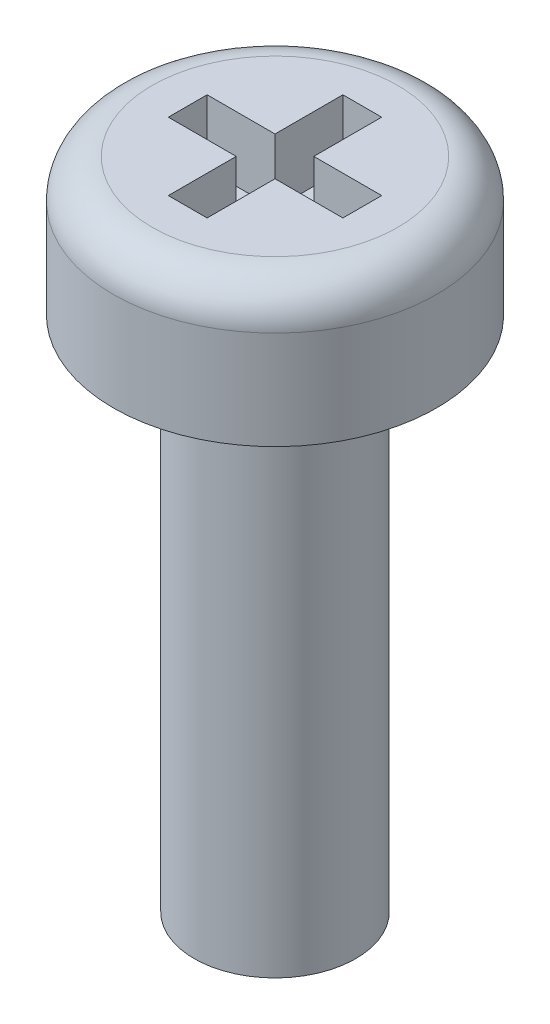
ISO-10303-21;
HEADER;
FILE_DESCRIPTION(('STEP AP214'),'2;1');
FILE_NAME('part.step','',(''),(''),'','','');
FILE_SCHEMA(('AUTOMOTIVE_DESIGN { 1 0 10303 214 1 1 1 1 }'));
ENDSEC;
DATA;
#1=APPLICATION_CONTEXT('core data for automotive mechanical design processes');
#2=APPLICATION_PROTOCOL_DEFINITION('international standard','automotive_design',2000,#1);
#3=PRODUCT_CONTEXT('',#1,'mechanical');
#4=PRODUCT('Part','Part','',(#3));
#5=PRODUCT_RELATED_PRODUCT_CATEGORY('part','',(#4));
#6=PRODUCT_DEFINITION_FORMATION('','',#4);
#7=PRODUCT_DEFINITION_CONTEXT('part definition',#1,'design');
#8=PRODUCT_DEFINITION('design','',#6,#7);
#9=PRODUCT_DEFINITION_SHAPE('','',#8);
#10=(LENGTH_UNIT() NAMED_UNIT(*) SI_UNIT(.MILLI.,.METRE.));
#11=(NAMED_UNIT(*) PLANE_ANGLE_UNIT() SI_UNIT($,.RADIAN.));
#12=(NAMED_UNIT(*) SI_UNIT($,.STERADIAN.) SOLID_ANGLE_UNIT());
#13=UNCERTAINTY_MEASURE_WITH_UNIT(LENGTH_MEASURE(1.E-05),#10,'distance_accuracy_value','');
#14=(GEOMETRIC_REPRESENTATION_CONTEXT(3) GLOBAL_UNCERTAINTY_ASSIGNED_CONTEXT((#13)) GLOBAL_UNIT_ASSIGNED_CONTEXT((#10,
#11,#12)) REPRESENTATION_CONTEXT('',''));
#15=CARTESIAN_POINT('',(0.,0.,0.));
#16=DIRECTION('',(0.,0.,1.));
#17=DIRECTION('',(1.,0.,0.));
#18=AXIS2_PLACEMENT_3D('',#15,#16,#17);
#19=CARTESIAN_POINT('',(1.25,0.,0.));
#20=DIRECTION('',(0.,-1.,0.));
#21=DIRECTION('',(0.,0.,-1.));
#22=AXIS2_PLACEMENT_3D('',#19,#20,#21);
#23=PLANE('',#22);
#24=CARTESIAN_POINT('',(0.,0.,0.));
#25=DIRECTION('',(0.,-1.,0.));
#26=DIRECTION('',(0.,0.,-1.));
#27=AXIS2_PLACEMENT_3D('',#24,#25,#26);
#28=CIRCLE('',#27,1.25);
#29=CARTESIAN_POINT('',(0.,0.,-1.25));
#30=VERTEX_POINT('',#29);
#31=EDGE_CURVE('E189',#30,#30,#28,.T.);
#32=ORIENTED_EDGE('',*,*,#31,.T.);
#33=EDGE_LOOP('',(#32));
#34=FACE_BOUND('',#33,.T.);
#35=ADVANCED_FACE('F33',(#34),#23,.T.);
#36=CARTESIAN_POINT('',(0.,10.12,0.));
#37=DIRECTION('',(0.,1.,0.));
#38=DIRECTION('',(0.,0.,1.));
#39=AXIS2_PLACEMENT_3D('',#36,#37,#38);
#40=PLANE('',#39);
#41=CARTESIAN_POINT('',(0.,10.12,0.));
#42=DIRECTION('',(0.,1.,0.));
#43=DIRECTION('',(0.,0.,1.));
#44=AXIS2_PLACEMENT_3D('',#41,#42,#43);
#45=CIRCLE('',#44,1.9);
#46=CARTESIAN_POINT('',(0.,10.12,1.9));
#47=VERTEX_POINT('',#46);
#48=EDGE_CURVE('E11',#47,#47,#45,.T.);
#49=ORIENTED_EDGE('',*,*,#48,.T.);
#50=EDGE_LOOP('',(#49));
#51=FACE_BOUND('',#50,.T.);
#52=DIRECTION('',(0.,0.,1.));
#53=VECTOR('',#52,1.);
#54=CARTESIAN_POINT('',(-1.35,10.12,0.3));
#55=LINE('',#54,#53);
#56=CARTESIAN_POINT('',(-1.35,10.12,-0.3));
#57=VERTEX_POINT('',#56);
#58=CARTESIAN_POINT('',(-1.35,10.12,0.3));
#59=VERTEX_POINT('',#58);
#60=EDGE_CURVE('E48',#57,#59,#55,.T.);
#61=ORIENTED_EDGE('',*,*,#60,.F.);
#62=DIRECTION('',(-1.,0.,0.));
#63=VECTOR('',#62,1.);
#64=CARTESIAN_POINT('',(-0.3,10.12,-0.3));
#65=LINE('',#64,#63);
#66=CARTESIAN_POINT('',(-0.3,10.12,-0.3));
#67=VERTEX_POINT('',#66);
#68=EDGE_CURVE('E185',#67,#57,#65,.T.);
#69=ORIENTED_EDGE('',*,*,#68,.F.);
#70=DIRECTION('',(0.,0.,1.));
#71=VECTOR('',#70,1.);
#72=CARTESIAN_POINT('',(-0.3,10.12,-0.3));
#73=LINE('',#72,#71);
#74=CARTESIAN_POINT('',(-0.3,10.12,-1.35));
#75=VERTEX_POINT('',#74);
#76=EDGE_CURVE('E183',#75,#67,#73,.T.);
#77=ORIENTED_EDGE('',*,*,#76,.F.);
#78=DIRECTION('',(-1.,0.,0.));
#79=VECTOR('',#78,1.);
#80=CARTESIAN_POINT('',(0.3,10.12,-1.35));
#81=LINE('',#80,#79);
#82=CARTESIAN_POINT('',(0.3,10.12,-1.35));
#83=VERTEX_POINT('',#82);
#84=EDGE_CURVE('E132',#83,#75,#81,.T.);
#85=ORIENTED_EDGE('',*,*,#84,.F.);
#86=DIRECTION('',(0.,0.,-1.));
#87=VECTOR('',#86,1.);
#88=CARTESIAN_POINT('',(0.299999999999999,10.12,-0.3));
#89=LINE('',#88,#87);
#90=CARTESIAN_POINT('',(0.299999999999999,10.12,-0.3));
#91=VERTEX_POINT('',#90);
#92=EDGE_CURVE('E179',#91,#83,#89,.T.);
#93=ORIENTED_EDGE('',*,*,#92,.F.);
#94=DIRECTION('',(-1.,0.,0.));
#95=VECTOR('',#94,1.);
#96=CARTESIAN_POINT('',(1.35,10.12,-0.3));
#97=LINE('',#96,#95);
#98=CARTESIAN_POINT('',(1.35,10.12,-0.3));
#99=VERTEX_POINT('',#98);
#100=EDGE_CURVE('E176',#99,#91,#97,.T.);
#101=ORIENTED_EDGE('',*,*,#100,.F.);
#102=DIRECTION('',(0.,0.,-1.));
#103=VECTOR('',#102,1.);
#104=CARTESIAN_POINT('',(1.35,10.12,0.3));
#105=LINE('',#104,#103);
#106=CARTESIAN_POINT('',(1.35,10.12,0.3));
#107=VERTEX_POINT('',#106);
#108=EDGE_CURVE('E173',#107,#99,#105,.T.);
#109=ORIENTED_EDGE('',*,*,#108,.F.);
#110=DIRECTION('',(1.,0.,0.));
#111=VECTOR('',#110,1.);
#112=CARTESIAN_POINT('',(1.35,10.12,0.3));
#113=LINE('',#112,#111);
#114=CARTESIAN_POINT('',(0.299999999999999,10.12,0.3));
#115=VERTEX_POINT('',#114);
#116=EDGE_CURVE('E170',#115,#107,#113,.T.);
#117=ORIENTED_EDGE('',*,*,#116,.F.);
#118=DIRECTION('',(0.,0.,-1.));
#119=VECTOR('',#118,1.);
#120=CARTESIAN_POINT('',(0.3,10.12,1.35));
#121=LINE('',#120,#119);
#122=CARTESIAN_POINT('',(0.3,10.12,1.35));
#123=VERTEX_POINT('',#122);
#124=EDGE_CURVE('E167',#123,#115,#121,.T.);
#125=ORIENTED_EDGE('',*,*,#124,.F.);
#126=DIRECTION('',(1.,0.,0.));
#127=VECTOR('',#126,1.);
#128=CARTESIAN_POINT('',(0.3,10.12,1.35));
#129=LINE('',#128,#127);
#130=CARTESIAN_POINT('',(-0.3,10.12,1.35));
#131=VERTEX_POINT('',#130);
#132=EDGE_CURVE('E164',#131,#123,#129,.T.);
#133=ORIENTED_EDGE('',*,*,#132,.F.);
#134=DIRECTION('',(0.,0.,1.));
#135=VECTOR('',#134,1.);
#136=CARTESIAN_POINT('',(-0.3,10.12,1.35));
#137=LINE('',#136,#135);
#138=CARTESIAN_POINT('',(-0.3,10.12,0.3));
#139=VERTEX_POINT('',#138);
#140=EDGE_CURVE('E161',#139,#131,#137,.T.);
#141=ORIENTED_EDGE('',*,*,#140,.F.);
#142=DIRECTION('',(1.,0.,0.));
#143=VECTOR('',#142,1.);
#144=CARTESIAN_POINT('',(-0.3,10.12,0.3));
#145=LINE('',#144,#143);
#146=EDGE_CURVE('E158',#59,#139,#145,.T.);
#147=ORIENTED_EDGE('',*,*,#146,.F.);
#148=EDGE_LOOP('',(#61,#69,#77,#85,#93,#101,#109,#117,#125,#133,#141,#147));
#149=FACE_BOUND('',#148,.T.);
#150=ADVANCED_FACE('F229',(#51,#149),#40,.T.);
#151=CARTESIAN_POINT('',(0.,0.,0.));
#152=DIRECTION('',(0.,-1.,0.));
#153=DIRECTION('',(0.,0.,-1.));
#154=AXIS2_PLACEMENT_3D('',#151,#152,#153);
#155=CYLINDRICAL_SURFACE('',#154,2.5);
#156=CARTESIAN_POINT('',(0.,9.52,0.));
#157=DIRECTION('',(0.,1.,0.));
#158=DIRECTION('',(0.,0.,1.));
#159=AXIS2_PLACEMENT_3D('',#156,#157,#158);
#160=CIRCLE('',#159,2.5);
#161=CARTESIAN_POINT('',(0.,9.52,2.5));
#162=VERTEX_POINT('',#161);
#163=EDGE_CURVE('E41',#162,#162,#160,.F.);
#164=ORIENTED_EDGE('',*,*,#163,.T.);
#165=EDGE_LOOP('',(#164));
#166=FACE_BOUND('',#165,.T.);
#167=CARTESIAN_POINT('',(0.,8.,0.));
#168=DIRECTION('',(0.,-1.,0.));
#169=DIRECTION('',(0.,0.,-1.));
#170=AXIS2_PLACEMENT_3D('',#167,#168,#169);
#171=CIRCLE('',#170,2.5);
#172=CARTESIAN_POINT('',(0.,8.,-2.5));
#173=VERTEX_POINT('',#172);
#174=EDGE_CURVE('E212',#173,#173,#171,.T.);
#175=ORIENTED_EDGE('',*,*,#174,.F.);
#176=EDGE_LOOP('',(#175));
#177=FACE_BOUND('',#176,.T.);
#178=ADVANCED_FACE('F217',(#166,#177),#155,.T.);
#179=CARTESIAN_POINT('',(2.5,8.,0.));
#180=DIRECTION('',(0.,-1.,0.));
#181=DIRECTION('',(0.,0.,-1.));
#182=AXIS2_PLACEMENT_3D('',#179,#180,#181);
#183=PLANE('',#182);
#184=ORIENTED_EDGE('',*,*,#174,.T.);
#185=EDGE_LOOP('',(#184));
#186=FACE_BOUND('',#185,.T.);
#187=CARTESIAN_POINT('',(0.,8.,0.));
#188=DIRECTION('',(0.,-1.,0.));
#189=DIRECTION('',(0.,0.,-1.));
#190=AXIS2_PLACEMENT_3D('',#187,#188,#189);
#191=CIRCLE('',#190,1.25);
#192=CARTESIAN_POINT('',(0.,8.,-1.25));
#193=VERTEX_POINT('',#192);
#194=EDGE_CURVE('E209',#193,#193,#191,.T.);
#195=ORIENTED_EDGE('',*,*,#194,.F.);
#196=EDGE_LOOP('',(#195));
#197=FACE_BOUND('',#196,.T.);
#198=ADVANCED_FACE('F239',(#186,#197),#183,.T.);
#199=CARTESIAN_POINT('',(0.,0.,0.));
#200=DIRECTION('',(0.,-1.,0.));
#201=DIRECTION('',(0.,0.,-1.));
#202=AXIS2_PLACEMENT_3D('',#199,#200,#201);
#203=CYLINDRICAL_SURFACE('',#202,1.25);
#204=ORIENTED_EDGE('',*,*,#194,.T.);
#205=EDGE_LOOP('',(#204));
#206=FACE_BOUND('',#205,.T.);
#207=ORIENTED_EDGE('',*,*,#31,.F.);
#208=EDGE_LOOP('',(#207));
#209=FACE_BOUND('',#208,.T.);
#210=ADVANCED_FACE('F242',(#206,#209),#203,.T.);
#211=CARTESIAN_POINT('',(-1.35,9.12,0.3));
#212=DIRECTION('',(-1.,0.,0.));
#213=DIRECTION('',(0.,0.,1.));
#214=AXIS2_PLACEMENT_3D('',#211,#212,#213);
#215=PLANE('',#214);
#216=ORIENTED_EDGE('',*,*,#60,.T.);
#217=DIRECTION('',(0.,1.,0.));
#218=VECTOR('',#217,1.);
#219=CARTESIAN_POINT('',(-1.35,9.12,0.3));
#220=LINE('',#219,#218);
#221=CARTESIAN_POINT('',(-1.35,9.12,0.3));
#222=VERTEX_POINT('',#221);
#223=EDGE_CURVE('E96',#222,#59,#220,.T.);
#224=ORIENTED_EDGE('',*,*,#223,.F.);
#225=DIRECTION('',(0.,0.,1.));
#226=VECTOR('',#225,1.);
#227=CARTESIAN_POINT('',(-1.35,9.12,0.3));
#228=LINE('',#227,#226);
#229=CARTESIAN_POINT('',(-1.35,9.12,-0.3));
#230=VERTEX_POINT('',#229);
#231=EDGE_CURVE('E187',#230,#222,#228,.T.);
#232=ORIENTED_EDGE('',*,*,#231,.F.);
#233=DIRECTION('',(0.,1.,0.));
#234=VECTOR('',#233,1.);
#235=CARTESIAN_POINT('',(-1.35,9.12,-0.3));
#236=LINE('',#235,#234);
#237=EDGE_CURVE('E56',#230,#57,#236,.T.);
#238=ORIENTED_EDGE('',*,*,#237,.T.);
#239=EDGE_LOOP('',(#216,#224,#232,#238));
#240=FACE_BOUND('',#239,.T.);
#241=ADVANCED_FACE('F246',(#240),#215,.F.);
#242=CARTESIAN_POINT('',(-0.3,9.12,-0.3));
#243=DIRECTION('',(0.,0.,-1.));
#244=DIRECTION('',(-1.,0.,0.));
#245=AXIS2_PLACEMENT_3D('',#242,#243,#244);
#246=PLANE('',#245);
#247=ORIENTED_EDGE('',*,*,#68,.T.);
#248=ORIENTED_EDGE('',*,*,#237,.F.);
#249=DIRECTION('',(-1.,0.,0.));
#250=VECTOR('',#249,1.);
#251=CARTESIAN_POINT('',(-0.3,9.12,-0.3));
#252=LINE('',#251,#250);
#253=CARTESIAN_POINT('',(-0.3,9.12,-0.3));
#254=VERTEX_POINT('',#253);
#255=EDGE_CURVE('E144',#254,#230,#252,.T.);
#256=ORIENTED_EDGE('',*,*,#255,.F.);
#257=DIRECTION('',(0.,1.,0.));
#258=VECTOR('',#257,1.);
#259=CARTESIAN_POINT('',(-0.3,9.12,-0.3));
#260=LINE('',#259,#258);
#261=EDGE_CURVE('E136',#254,#67,#260,.T.);
#262=ORIENTED_EDGE('',*,*,#261,.T.);
#263=EDGE_LOOP('',(#247,#248,#256,#262));
#264=FACE_BOUND('',#263,.T.);
#265=ADVANCED_FACE('F250',(#264),#246,.F.);
#266=CARTESIAN_POINT('',(-0.3,9.12,-0.3));
#267=DIRECTION('',(-1.,0.,0.));
#268=DIRECTION('',(0.,0.,1.));
#269=AXIS2_PLACEMENT_3D('',#266,#267,#268);
#270=PLANE('',#269);
#271=ORIENTED_EDGE('',*,*,#76,.T.);
#272=ORIENTED_EDGE('',*,*,#261,.F.);
#273=DIRECTION('',(0.,0.,1.));
#274=VECTOR('',#273,1.);
#275=CARTESIAN_POINT('',(-0.3,9.12,-0.3));
#276=LINE('',#275,#274);
#277=CARTESIAN_POINT('',(-0.3,9.12,-1.35));
#278=VERTEX_POINT('',#277);
#279=EDGE_CURVE('E140',#278,#254,#276,.T.);
#280=ORIENTED_EDGE('',*,*,#279,.F.);
#281=DIRECTION('',(0.,1.,0.));
#282=VECTOR('',#281,1.);
#283=CARTESIAN_POINT('',(-0.3,9.12,-1.35));
#284=LINE('',#283,#282);
#285=EDGE_CURVE('E125',#278,#75,#284,.T.);
#286=ORIENTED_EDGE('',*,*,#285,.T.);
#287=EDGE_LOOP('',(#271,#272,#280,#286));
#288=FACE_BOUND('',#287,.T.);
#289=ADVANCED_FACE('F141',(#288),#270,.F.);
#290=CARTESIAN_POINT('',(0.3,9.12,-1.35));
#291=DIRECTION('',(0.,0.,-1.));
#292=DIRECTION('',(-1.,0.,0.));
#293=AXIS2_PLACEMENT_3D('',#290,#291,#292);
#294=PLANE('',#293);
#295=ORIENTED_EDGE('',*,*,#84,.T.);
#296=ORIENTED_EDGE('',*,*,#285,.F.);
#297=DIRECTION('',(-1.,0.,0.));
#298=VECTOR('',#297,1.);
#299=CARTESIAN_POINT('',(0.3,9.12,-1.35));
#300=LINE('',#299,#298);
#301=CARTESIAN_POINT('',(0.3,9.12,-1.35));
#302=VERTEX_POINT('',#301);
#303=EDGE_CURVE('E129',#302,#278,#300,.T.);
#304=ORIENTED_EDGE('',*,*,#303,.F.);
#305=DIRECTION('',(0.,1.,0.));
#306=VECTOR('',#305,1.);
#307=CARTESIAN_POINT('',(0.3,9.12,-1.35));
#308=LINE('',#307,#306);
#309=EDGE_CURVE('E137',#302,#83,#308,.T.);
#310=ORIENTED_EDGE('',*,*,#309,.T.);
#311=EDGE_LOOP('',(#295,#296,#304,#310));
#312=FACE_BOUND('',#311,.T.);
#313=ADVANCED_FACE('F127',(#312),#294,.F.);
#314=CARTESIAN_POINT('',(0.299999999999999,9.12,-0.3));
#315=DIRECTION('',(1.,0.,0.));
#316=DIRECTION('',(0.,0.,-1.));
#317=AXIS2_PLACEMENT_3D('',#314,#315,#316);
#318=PLANE('',#317);
#319=ORIENTED_EDGE('',*,*,#92,.T.);
#320=ORIENTED_EDGE('',*,*,#309,.F.);
#321=DIRECTION('',(0.,0.,-1.));
#322=VECTOR('',#321,1.);
#323=CARTESIAN_POINT('',(0.299999999999999,9.12,-0.3));
#324=LINE('',#323,#322);
#325=CARTESIAN_POINT('',(0.299999999999999,9.12,-0.3));
#326=VERTEX_POINT('',#325);
#327=EDGE_CURVE('E150',#326,#302,#324,.T.);
#328=ORIENTED_EDGE('',*,*,#327,.F.);
#329=DIRECTION('',(0.,1.,0.));
#330=VECTOR('',#329,1.);
#331=CARTESIAN_POINT('',(0.299999999999999,9.12,-0.3));
#332=LINE('',#331,#330);
#333=EDGE_CURVE('E192',#326,#91,#332,.T.);
#334=ORIENTED_EDGE('',*,*,#333,.T.);
#335=EDGE_LOOP('',(#319,#320,#328,#334));
#336=FACE_BOUND('',#335,.T.);
#337=ADVANCED_FACE('F277',(#336),#318,.F.);
#338=CARTESIAN_POINT('',(1.35,9.12,-0.3));
#339=DIRECTION('',(0.,0.,-1.));
#340=DIRECTION('',(-1.,0.,0.));
#341=AXIS2_PLACEMENT_3D('',#338,#339,#340);
#342=PLANE('',#341);
#343=ORIENTED_EDGE('',*,*,#100,.T.);
#344=ORIENTED_EDGE('',*,*,#333,.F.);
#345=DIRECTION('',(-1.,0.,0.));
#346=VECTOR('',#345,1.);
#347=CARTESIAN_POINT('',(1.35,9.12,-0.3));
#348=LINE('',#347,#346);
#349=CARTESIAN_POINT('',(1.35,9.12,-0.3));
#350=VERTEX_POINT('',#349);
#351=EDGE_CURVE('E152',#350,#326,#348,.T.);
#352=ORIENTED_EDGE('',*,*,#351,.F.);
#353=DIRECTION('',(0.,1.,0.));
#354=VECTOR('',#353,1.);
#355=CARTESIAN_POINT('',(1.35,9.12,-0.3));
#356=LINE('',#355,#354);
#357=EDGE_CURVE('E194',#350,#99,#356,.T.);
#358=ORIENTED_EDGE('',*,*,#357,.T.);
#359=EDGE_LOOP('',(#343,#344,#352,#358));
#360=FACE_BOUND('',#359,.T.);
#361=ADVANCED_FACE('F273',(#360),#342,.F.);
#362=CARTESIAN_POINT('',(1.35,9.12,0.3));
#363=DIRECTION('',(1.,0.,0.));
#364=DIRECTION('',(0.,0.,-1.));
#365=AXIS2_PLACEMENT_3D('',#362,#363,#364);
#366=PLANE('',#365);
#367=ORIENTED_EDGE('',*,*,#108,.T.);
#368=ORIENTED_EDGE('',*,*,#357,.F.);
#369=DIRECTION('',(0.,0.,-1.));
#370=VECTOR('',#369,1.);
#371=CARTESIAN_POINT('',(1.35,9.12,0.3));
#372=LINE('',#371,#370);
#373=CARTESIAN_POINT('',(1.35,9.12,0.3));
#374=VERTEX_POINT('',#373);
#375=EDGE_CURVE('E312',#374,#350,#372,.T.);
#376=ORIENTED_EDGE('',*,*,#375,.F.);
#377=DIRECTION('',(0.,1.,0.));
#378=VECTOR('',#377,1.);
#379=CARTESIAN_POINT('',(1.35,9.12,0.3));
#380=LINE('',#379,#378);
#381=EDGE_CURVE('E196',#374,#107,#380,.T.);
#382=ORIENTED_EDGE('',*,*,#381,.T.);
#383=EDGE_LOOP('',(#367,#368,#376,#382));
#384=FACE_BOUND('',#383,.T.);
#385=ADVANCED_FACE('F269',(#384),#366,.F.);
#386=CARTESIAN_POINT('',(1.35,9.12,0.3));
#387=DIRECTION('',(0.,0.,1.));
#388=DIRECTION('',(1.,0.,0.));
#389=AXIS2_PLACEMENT_3D('',#386,#387,#388);
#390=PLANE('',#389);
#391=ORIENTED_EDGE('',*,*,#116,.T.);
#392=ORIENTED_EDGE('',*,*,#381,.F.);
#393=DIRECTION('',(1.,0.,0.));
#394=VECTOR('',#393,1.);
#395=CARTESIAN_POINT('',(1.35,9.12,0.3));
#396=LINE('',#395,#394);
#397=CARTESIAN_POINT('',(0.299999999999999,9.12,0.3));
#398=VERTEX_POINT('',#397);
#399=EDGE_CURVE('E309',#398,#374,#396,.T.);
#400=ORIENTED_EDGE('',*,*,#399,.F.);
#401=DIRECTION('',(0.,1.,0.));
#402=VECTOR('',#401,1.);
#403=CARTESIAN_POINT('',(0.299999999999999,9.12,0.3));
#404=LINE('',#403,#402);
#405=EDGE_CURVE('E198',#398,#115,#404,.T.);
#406=ORIENTED_EDGE('',*,*,#405,.T.);
#407=EDGE_LOOP('',(#391,#392,#400,#406));
#408=FACE_BOUND('',#407,.T.);
#409=ADVANCED_FACE('F265',(#408),#390,.F.);
#410=CARTESIAN_POINT('',(0.3,9.12,1.35));
#411=DIRECTION('',(1.,0.,0.));
#412=DIRECTION('',(0.,0.,-1.));
#413=AXIS2_PLACEMENT_3D('',#410,#411,#412);
#414=PLANE('',#413);
#415=ORIENTED_EDGE('',*,*,#124,.T.);
#416=ORIENTED_EDGE('',*,*,#405,.F.);
#417=DIRECTION('',(0.,0.,-1.));
#418=VECTOR('',#417,1.);
#419=CARTESIAN_POINT('',(0.3,9.12,1.35));
#420=LINE('',#419,#418);
#421=CARTESIAN_POINT('',(0.3,9.12,1.35));
#422=VERTEX_POINT('',#421);
#423=EDGE_CURVE('E306',#422,#398,#420,.T.);
#424=ORIENTED_EDGE('',*,*,#423,.F.);
#425=DIRECTION('',(0.,1.,0.));
#426=VECTOR('',#425,1.);
#427=CARTESIAN_POINT('',(0.3,9.12,1.35));
#428=LINE('',#427,#426);
#429=EDGE_CURVE('E200',#422,#123,#428,.T.);
#430=ORIENTED_EDGE('',*,*,#429,.T.);
#431=EDGE_LOOP('',(#415,#416,#424,#430));
#432=FACE_BOUND('',#431,.T.);
#433=ADVANCED_FACE('F261',(#432),#414,.F.);
#434=CARTESIAN_POINT('',(0.3,9.12,1.35));
#435=DIRECTION('',(0.,0.,1.));
#436=DIRECTION('',(1.,0.,0.));
#437=AXIS2_PLACEMENT_3D('',#434,#435,#436);
#438=PLANE('',#437);
#439=ORIENTED_EDGE('',*,*,#132,.T.);
#440=ORIENTED_EDGE('',*,*,#429,.F.);
#441=DIRECTION('',(1.,0.,0.));
#442=VECTOR('',#441,1.);
#443=CARTESIAN_POINT('',(0.3,9.12,1.35));
#444=LINE('',#443,#442);
#445=CARTESIAN_POINT('',(-0.3,9.12,1.35));
#446=VERTEX_POINT('',#445);
#447=EDGE_CURVE('E303',#446,#422,#444,.T.);
#448=ORIENTED_EDGE('',*,*,#447,.F.);
#449=DIRECTION('',(0.,1.,0.));
#450=VECTOR('',#449,1.);
#451=CARTESIAN_POINT('',(-0.3,9.12,1.35));
#452=LINE('',#451,#450);
#453=EDGE_CURVE('E202',#446,#131,#452,.T.);
#454=ORIENTED_EDGE('',*,*,#453,.T.);
#455=EDGE_LOOP('',(#439,#440,#448,#454));
#456=FACE_BOUND('',#455,.T.);
#457=ADVANCED_FACE('F257',(#456),#438,.F.);
#458=CARTESIAN_POINT('',(-0.3,9.12,1.35));
#459=DIRECTION('',(-1.,0.,0.));
#460=DIRECTION('',(0.,0.,1.));
#461=AXIS2_PLACEMENT_3D('',#458,#459,#460);
#462=PLANE('',#461);
#463=ORIENTED_EDGE('',*,*,#140,.T.);
#464=ORIENTED_EDGE('',*,*,#453,.F.);
#465=DIRECTION('',(0.,0.,1.));
#466=VECTOR('',#465,1.);
#467=CARTESIAN_POINT('',(-0.3,9.12,1.35));
#468=LINE('',#467,#466);
#469=CARTESIAN_POINT('',(-0.3,9.12,0.3));
#470=VERTEX_POINT('',#469);
#471=EDGE_CURVE('E298',#470,#446,#468,.T.);
#472=ORIENTED_EDGE('',*,*,#471,.F.);
#473=DIRECTION('',(0.,1.,0.));
#474=VECTOR('',#473,1.);
#475=CARTESIAN_POINT('',(-0.3,9.12,0.3));
#476=LINE('',#475,#474);
#477=EDGE_CURVE('E204',#470,#139,#476,.T.);
#478=ORIENTED_EDGE('',*,*,#477,.T.);
#479=EDGE_LOOP('',(#463,#464,#472,#478));
#480=FACE_BOUND('',#479,.T.);
#481=ADVANCED_FACE('F253',(#480),#462,.F.);
#482=CARTESIAN_POINT('',(-0.3,9.12,0.3));
#483=DIRECTION('',(0.,0.,1.));
#484=DIRECTION('',(1.,0.,0.));
#485=AXIS2_PLACEMENT_3D('',#482,#483,#484);
#486=PLANE('',#485);
#487=ORIENTED_EDGE('',*,*,#146,.T.);
#488=ORIENTED_EDGE('',*,*,#477,.F.);
#489=DIRECTION('',(1.,0.,0.));
#490=VECTOR('',#489,1.);
#491=CARTESIAN_POINT('',(-0.3,9.12,0.3));
#492=LINE('',#491,#490);
#493=EDGE_CURVE('E296',#222,#470,#492,.T.);
#494=ORIENTED_EDGE('',*,*,#493,.F.);
#495=ORIENTED_EDGE('',*,*,#223,.T.);
#496=EDGE_LOOP('',(#487,#488,#494,#495));
#497=FACE_BOUND('',#496,.T.);
#498=ADVANCED_FACE('F225',(#497),#486,.F.);
#499=CARTESIAN_POINT('',(0.,9.12,0.));
#500=DIRECTION('',(0.,1.,0.));
#501=DIRECTION('',(0.,0.,1.));
#502=AXIS2_PLACEMENT_3D('',#499,#500,#501);
#503=PLANE('',#502);
#504=ORIENTED_EDGE('',*,*,#231,.T.);
#505=ORIENTED_EDGE('',*,*,#493,.T.);
#506=ORIENTED_EDGE('',*,*,#471,.T.);
#507=ORIENTED_EDGE('',*,*,#447,.T.);
#508=ORIENTED_EDGE('',*,*,#423,.T.);
#509=ORIENTED_EDGE('',*,*,#399,.T.);
#510=ORIENTED_EDGE('',*,*,#375,.T.);
#511=ORIENTED_EDGE('',*,*,#351,.T.);
#512=ORIENTED_EDGE('',*,*,#327,.T.);
#513=ORIENTED_EDGE('',*,*,#303,.T.);
#514=ORIENTED_EDGE('',*,*,#279,.T.);
#515=ORIENTED_EDGE('',*,*,#255,.T.);
#516=EDGE_LOOP('',(#504,#505,#506,#507,#508,#509,#510,#511,#512,#513,#514,#515));
#517=FACE_BOUND('',#516,.T.);
#518=ADVANCED_FACE('F147',(#517),#503,.T.);
#519=CARTESIAN_POINT('',(0.,9.52,0.));
#520=DIRECTION('',(0.,1.,0.));
#521=DIRECTION('',(0.,0.,1.));
#522=AXIS2_PLACEMENT_3D('',#519,#520,#521);
#523=TOROIDAL_SURFACE('',#522,1.9,0.6);
#524=ORIENTED_EDGE('',*,*,#48,.F.);
#525=EDGE_LOOP('',(#524));
#526=FACE_BOUND('',#525,.T.);
#527=ORIENTED_EDGE('',*,*,#163,.F.);
#528=EDGE_LOOP('',(#527));
#529=FACE_BOUND('',#528,.T.);
#530=ADVANCED_FACE('F35',(#526,#529),#523,.T.);
#531=CLOSED_SHELL('',(#35,#150,#178,#198,#210,#241,#265,#289,#313,#337,#361,#385,#409,#433,#457,
#481,#498,#518,#530));
#532=MANIFOLD_SOLID_BREP('B2',#531);
#533=ADVANCED_BREP_SHAPE_REPRESENTATION('',(#18,#532),#14);
#534=SHAPE_DEFINITION_REPRESENTATION(#9,#533);
ENDSEC;
END-ISO-10303-21;
